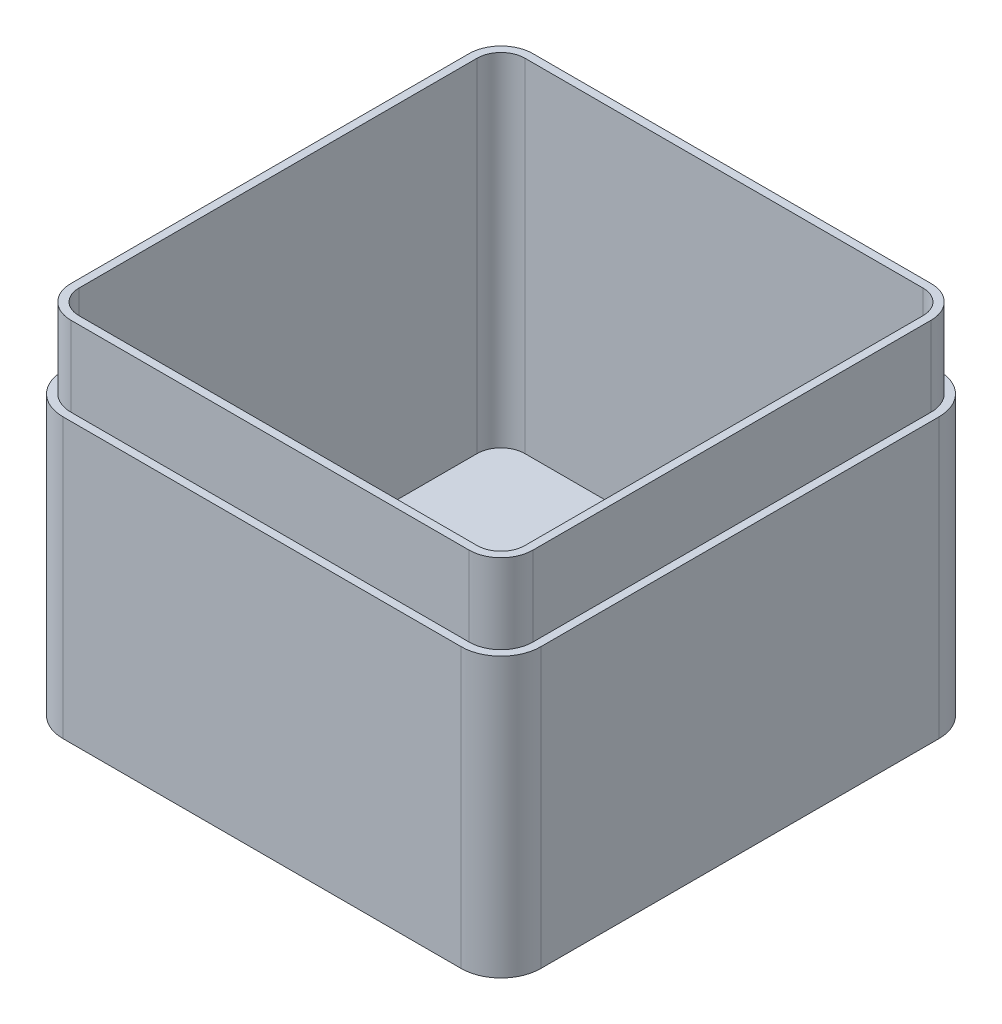
ISO-10303-21;
HEADER;
FILE_DESCRIPTION(('STEP AP214'),'2;1');
FILE_NAME('part.step','',(''),(''),'','','');
FILE_SCHEMA(('AUTOMOTIVE_DESIGN { 1 0 10303 214 1 1 1 1 }'));
ENDSEC;
DATA;
#1=APPLICATION_CONTEXT('core data for automotive mechanical design processes');
#2=APPLICATION_PROTOCOL_DEFINITION('international standard','automotive_design',2000,#1);
#3=PRODUCT_CONTEXT('',#1,'mechanical');
#4=PRODUCT('Part','Part','',(#3));
#5=PRODUCT_RELATED_PRODUCT_CATEGORY('part','',(#4));
#6=PRODUCT_DEFINITION_FORMATION('','',#4);
#7=PRODUCT_DEFINITION_CONTEXT('part definition',#1,'design');
#8=PRODUCT_DEFINITION('design','',#6,#7);
#9=PRODUCT_DEFINITION_SHAPE('','',#8);
#10=(LENGTH_UNIT() NAMED_UNIT(*) SI_UNIT(.MILLI.,.METRE.));
#11=(NAMED_UNIT(*) PLANE_ANGLE_UNIT() SI_UNIT($,.RADIAN.));
#12=(NAMED_UNIT(*) SI_UNIT($,.STERADIAN.) SOLID_ANGLE_UNIT());
#13=UNCERTAINTY_MEASURE_WITH_UNIT(LENGTH_MEASURE(1.E-05),#10,'distance_accuracy_value','');
#14=(GEOMETRIC_REPRESENTATION_CONTEXT(3) GLOBAL_UNCERTAINTY_ASSIGNED_CONTEXT((#13)) GLOBAL_UNIT_ASSIGNED_CONTEXT((#10,
#11,#12)) REPRESENTATION_CONTEXT('',''));
#15=CARTESIAN_POINT('',(0.,0.,0.));
#16=DIRECTION('',(0.,0.,1.));
#17=DIRECTION('',(1.,0.,0.));
#18=AXIS2_PLACEMENT_3D('',#15,#16,#17);
#19=CARTESIAN_POINT('',(0.,90.,0.));
#20=DIRECTION('',(0.,-1.,0.));
#21=DIRECTION('',(0.,0.,-1.));
#22=AXIS2_PLACEMENT_3D('',#19,#20,#21);
#23=PLANE('',#22);
#24=DIRECTION('',(0.,0.,-1.));
#25=VECTOR('',#24,1.);
#26=CARTESIAN_POINT('',(56.,90.,0.));
#27=LINE('',#26,#25);
#28=CARTESIAN_POINT('',(56.,90.,50.));
#29=VERTEX_POINT('',#28);
#30=CARTESIAN_POINT('',(56.,90.,-50.));
#31=VERTEX_POINT('',#30);
#32=EDGE_CURVE('E344',#29,#31,#27,.T.);
#33=ORIENTED_EDGE('',*,*,#32,.F.);
#34=CARTESIAN_POINT('',(50.,90.,50.));
#35=DIRECTION('',(0.,-1.,0.));
#36=DIRECTION('',(0.,0.,-1.));
#37=AXIS2_PLACEMENT_3D('',#34,#35,#36);
#38=CIRCLE('',#37,6.);
#39=CARTESIAN_POINT('',(50.,90.,56.));
#40=VERTEX_POINT('',#39);
#41=EDGE_CURVE('E390',#40,#29,#38,.F.);
#42=ORIENTED_EDGE('',*,*,#41,.F.);
#43=DIRECTION('',(1.,0.,0.));
#44=VECTOR('',#43,1.);
#45=CARTESIAN_POINT('',(0.,90.,56.));
#46=LINE('',#45,#44);
#47=CARTESIAN_POINT('',(-50.,90.,56.));
#48=VERTEX_POINT('',#47);
#49=EDGE_CURVE('E359',#48,#40,#46,.T.);
#50=ORIENTED_EDGE('',*,*,#49,.F.);
#51=CARTESIAN_POINT('',(-50.,90.,50.));
#52=DIRECTION('',(0.,-1.,0.));
#53=DIRECTION('',(0.,0.,-1.));
#54=AXIS2_PLACEMENT_3D('',#51,#52,#53);
#55=CIRCLE('',#54,6.);
#56=CARTESIAN_POINT('',(-56.,90.,50.));
#57=VERTEX_POINT('',#56);
#58=EDGE_CURVE('E323',#57,#48,#55,.F.);
#59=ORIENTED_EDGE('',*,*,#58,.F.);
#60=DIRECTION('',(0.,0.,1.));
#61=VECTOR('',#60,1.);
#62=CARTESIAN_POINT('',(-56.,90.,0.));
#63=LINE('',#62,#61);
#64=CARTESIAN_POINT('',(-56.,90.,-50.));
#65=VERTEX_POINT('',#64);
#66=EDGE_CURVE('E387',#65,#57,#63,.T.);
#67=ORIENTED_EDGE('',*,*,#66,.F.);
#68=CARTESIAN_POINT('',(-50.,90.,-50.));
#69=DIRECTION('',(0.,-1.,0.));
#70=DIRECTION('',(0.,0.,-1.));
#71=AXIS2_PLACEMENT_3D('',#68,#69,#70);
#72=CIRCLE('',#71,6.);
#73=CARTESIAN_POINT('',(-50.,90.,-56.));
#74=VERTEX_POINT('',#73);
#75=EDGE_CURVE('E383',#74,#65,#72,.F.);
#76=ORIENTED_EDGE('',*,*,#75,.F.);
#77=DIRECTION('',(-1.,0.,0.));
#78=VECTOR('',#77,1.);
#79=CARTESIAN_POINT('',(0.,90.,-56.));
#80=LINE('',#79,#78);
#81=CARTESIAN_POINT('',(50.,90.,-56.));
#82=VERTEX_POINT('',#81);
#83=EDGE_CURVE('E380',#82,#74,#80,.T.);
#84=ORIENTED_EDGE('',*,*,#83,.F.);
#85=CARTESIAN_POINT('',(50.,90.,-50.));
#86=DIRECTION('',(0.,-1.,0.));
#87=DIRECTION('',(0.,0.,-1.));
#88=AXIS2_PLACEMENT_3D('',#85,#86,#87);
#89=CIRCLE('',#88,6.);
#90=EDGE_CURVE('E368',#31,#82,#89,.F.);
#91=ORIENTED_EDGE('',*,*,#90,.F.);
#92=EDGE_LOOP('',(#33,#42,#50,#59,#67,#76,#84,#91));
#93=FACE_BOUND('',#92,.T.);
#94=CARTESIAN_POINT('',(50.,90.0000000000007,50.0000000000002));
#95=DIRECTION('',(0.,1.00000000000001,0.));
#96=DIRECTION('',(0.,0.,1.00000000000001));
#97=AXIS2_PLACEMENT_3D('',#94,#95,#96);
#98=CIRCLE('',#97,8.);
#99=CARTESIAN_POINT('',(50.,90.,58.));
#100=VERTEX_POINT('',#99);
#101=CARTESIAN_POINT('',(58.,90.0000000000007,50.0000000000002));
#102=VERTEX_POINT('',#101);
#103=EDGE_CURVE('E55',#100,#102,#98,.T.);
#104=ORIENTED_EDGE('',*,*,#103,.T.);
#105=DIRECTION('',(0.,0.,-1.00000000000001));
#106=VECTOR('',#105,1.);
#107=CARTESIAN_POINT('',(58.,90.0000000000007,0.));
#108=LINE('',#107,#106);
#109=CARTESIAN_POINT('',(58.,90.0000000000006,-50.0000000000005));
#110=VERTEX_POINT('',#109);
#111=EDGE_CURVE('E226',#102,#110,#108,.T.);
#112=ORIENTED_EDGE('',*,*,#111,.T.);
#113=CARTESIAN_POINT('',(50.,90.0000000000006,-50.0000000000005));
#114=DIRECTION('',(0.,1.00000000000001,0.));
#115=DIRECTION('',(0.,0.,1.00000000000001));
#116=AXIS2_PLACEMENT_3D('',#113,#114,#115);
#117=CIRCLE('',#116,8.00000000000001);
#118=CARTESIAN_POINT('',(50.,90.0000000000007,-58.0000000000006));
#119=VERTEX_POINT('',#118);
#120=EDGE_CURVE('E230',#110,#119,#117,.T.);
#121=ORIENTED_EDGE('',*,*,#120,.T.);
#122=DIRECTION('',(-1.,0.,0.));
#123=VECTOR('',#122,1.);
#124=CARTESIAN_POINT('',(0.,90.0000000000007,-58.0000000000006));
#125=LINE('',#124,#123);
#126=CARTESIAN_POINT('',(-50.,90.0000000000007,-58.0000000000006));
#127=VERTEX_POINT('',#126);
#128=EDGE_CURVE('E288',#119,#127,#125,.T.);
#129=ORIENTED_EDGE('',*,*,#128,.T.);
#130=CARTESIAN_POINT('',(-50.,90.0000000000006,-50.0000000000005));
#131=DIRECTION('',(0.,1.00000000000001,0.));
#132=DIRECTION('',(0.,0.,1.00000000000001));
#133=AXIS2_PLACEMENT_3D('',#130,#131,#132);
#134=CIRCLE('',#133,8.00000000000001);
#135=CARTESIAN_POINT('',(-58.,90.0000000000006,-50.0000000000005));
#136=VERTEX_POINT('',#135);
#137=EDGE_CURVE('E284',#127,#136,#134,.T.);
#138=ORIENTED_EDGE('',*,*,#137,.T.);
#139=DIRECTION('',(0.,0.,1.00000000000001));
#140=VECTOR('',#139,1.);
#141=CARTESIAN_POINT('',(-58.,90.0000000000007,0.));
#142=LINE('',#141,#140);
#143=CARTESIAN_POINT('',(-58.,90.0000000000007,50.0000000000002));
#144=VERTEX_POINT('',#143);
#145=EDGE_CURVE('E280',#136,#144,#142,.T.);
#146=ORIENTED_EDGE('',*,*,#145,.T.);
#147=CARTESIAN_POINT('',(-50.,90.0000000000007,50.0000000000002));
#148=DIRECTION('',(0.,1.00000000000001,0.));
#149=DIRECTION('',(0.,0.,1.00000000000001));
#150=AXIS2_PLACEMENT_3D('',#147,#148,#149);
#151=CIRCLE('',#150,8.);
#152=CARTESIAN_POINT('',(-50.,90.0000000000013,58.));
#153=VERTEX_POINT('',#152);
#154=EDGE_CURVE('E276',#144,#153,#151,.T.);
#155=ORIENTED_EDGE('',*,*,#154,.T.);
#156=DIRECTION('',(1.,0.,0.));
#157=VECTOR('',#156,1.);
#158=CARTESIAN_POINT('',(0.,90.0000000000013,58.));
#159=LINE('',#158,#157);
#160=EDGE_CURVE('E273',#153,#100,#159,.T.);
#161=ORIENTED_EDGE('',*,*,#160,.T.);
#162=EDGE_LOOP('',(#104,#112,#121,#129,#138,#146,#155,#161));
#163=FACE_BOUND('',#162,.T.);
#164=ADVANCED_FACE('F39',(#93,#163),#23,.F.);
#165=CARTESIAN_POINT('',(56.,90.,60.));
#166=DIRECTION('',(-1.,0.,0.));
#167=DIRECTION('',(0.,0.,1.));
#168=AXIS2_PLACEMENT_3D('',#165,#166,#167);
#169=PLANE('',#168);
#170=DIRECTION('',(0.,0.,-1.));
#171=VECTOR('',#170,1.);
#172=CARTESIAN_POINT('',(56.,4.,0.));
#173=LINE('',#172,#171);
#174=CARTESIAN_POINT('',(56.,4.,50.));
#175=VERTEX_POINT('',#174);
#176=CARTESIAN_POINT('',(56.,4.,-50.));
#177=VERTEX_POINT('',#176);
#178=EDGE_CURVE('E298',#175,#177,#173,.T.);
#179=ORIENTED_EDGE('',*,*,#178,.F.);
#180=DIRECTION('',(0.,1.,0.));
#181=VECTOR('',#180,1.);
#182=CARTESIAN_POINT('',(56.,90.,50.));
#183=LINE('',#182,#181);
#184=EDGE_CURVE('E324',#29,#175,#183,.F.);
#185=ORIENTED_EDGE('',*,*,#184,.F.);
#186=ORIENTED_EDGE('',*,*,#32,.T.);
#187=DIRECTION('',(0.,1.,0.));
#188=VECTOR('',#187,1.);
#189=CARTESIAN_POINT('',(56.,90.,-50.));
#190=LINE('',#189,#188);
#191=EDGE_CURVE('E320',#177,#31,#190,.T.);
#192=ORIENTED_EDGE('',*,*,#191,.F.);
#193=EDGE_LOOP('',(#179,#185,#186,#192));
#194=FACE_BOUND('',#193,.T.);
#195=ADVANCED_FACE('F498',(#194),#169,.T.);
#196=CARTESIAN_POINT('',(-60.,90.,-56.));
#197=DIRECTION('',(0.,0.,1.));
#198=DIRECTION('',(1.,0.,0.));
#199=AXIS2_PLACEMENT_3D('',#196,#197,#198);
#200=PLANE('',#199);
#201=ORIENTED_EDGE('',*,*,#83,.T.);
#202=DIRECTION('',(0.,1.,0.));
#203=VECTOR('',#202,1.);
#204=CARTESIAN_POINT('',(-50.,90.,-56.));
#205=LINE('',#204,#203);
#206=CARTESIAN_POINT('',(-50.,4.,-56.));
#207=VERTEX_POINT('',#206);
#208=EDGE_CURVE('E356',#207,#74,#205,.T.);
#209=ORIENTED_EDGE('',*,*,#208,.F.);
#210=DIRECTION('',(-1.,0.,0.));
#211=VECTOR('',#210,1.);
#212=CARTESIAN_POINT('',(0.,4.,-56.));
#213=LINE('',#212,#211);
#214=CARTESIAN_POINT('',(50.,4.,-56.));
#215=VERTEX_POINT('',#214);
#216=EDGE_CURVE('E319',#215,#207,#213,.T.);
#217=ORIENTED_EDGE('',*,*,#216,.F.);
#218=DIRECTION('',(0.,1.,0.));
#219=VECTOR('',#218,1.);
#220=CARTESIAN_POINT('',(50.,90.,-56.));
#221=LINE('',#220,#219);
#222=EDGE_CURVE('E347',#82,#215,#221,.F.);
#223=ORIENTED_EDGE('',*,*,#222,.F.);
#224=EDGE_LOOP('',(#201,#209,#217,#223));
#225=FACE_BOUND('',#224,.T.);
#226=ADVANCED_FACE('F504',(#225),#200,.T.);
#227=CARTESIAN_POINT('',(-56.,90.,60.));
#228=DIRECTION('',(1.,0.,0.));
#229=DIRECTION('',(0.,0.,-1.));
#230=AXIS2_PLACEMENT_3D('',#227,#228,#229);
#231=PLANE('',#230);
#232=ORIENTED_EDGE('',*,*,#66,.T.);
#233=DIRECTION('',(0.,1.,0.));
#234=VECTOR('',#233,1.);
#235=CARTESIAN_POINT('',(-56.,90.,50.));
#236=LINE('',#235,#234);
#237=CARTESIAN_POINT('',(-56.,4.,50.));
#238=VERTEX_POINT('',#237);
#239=EDGE_CURVE('E365',#238,#57,#236,.T.);
#240=ORIENTED_EDGE('',*,*,#239,.F.);
#241=DIRECTION('',(0.,0.,1.));
#242=VECTOR('',#241,1.);
#243=CARTESIAN_POINT('',(-56.,4.,0.));
#244=LINE('',#243,#242);
#245=CARTESIAN_POINT('',(-56.,4.,-50.));
#246=VERTEX_POINT('',#245);
#247=EDGE_CURVE('E332',#246,#238,#244,.T.);
#248=ORIENTED_EDGE('',*,*,#247,.F.);
#249=DIRECTION('',(0.,1.,0.));
#250=VECTOR('',#249,1.);
#251=CARTESIAN_POINT('',(-56.,90.,-50.));
#252=LINE('',#251,#250);
#253=EDGE_CURVE('E360',#65,#246,#252,.F.);
#254=ORIENTED_EDGE('',*,*,#253,.F.);
#255=EDGE_LOOP('',(#232,#240,#248,#254));
#256=FACE_BOUND('',#255,.T.);
#257=ADVANCED_FACE('F699',(#256),#231,.T.);
#258=CARTESIAN_POINT('',(-60.,90.,56.));
#259=DIRECTION('',(0.,0.,-1.));
#260=DIRECTION('',(-1.,0.,0.));
#261=AXIS2_PLACEMENT_3D('',#258,#259,#260);
#262=PLANE('',#261);
#263=DIRECTION('',(1.,0.,0.));
#264=VECTOR('',#263,1.);
#265=CARTESIAN_POINT('',(0.,4.,56.));
#266=LINE('',#265,#264);
#267=CARTESIAN_POINT('',(-50.,4.,56.));
#268=VERTEX_POINT('',#267);
#269=CARTESIAN_POINT('',(50.,4.,56.));
#270=VERTEX_POINT('',#269);
#271=EDGE_CURVE('E340',#268,#270,#266,.T.);
#272=ORIENTED_EDGE('',*,*,#271,.F.);
#273=DIRECTION('',(0.,1.,0.));
#274=VECTOR('',#273,1.);
#275=CARTESIAN_POINT('',(-50.,90.,56.));
#276=LINE('',#275,#274);
#277=EDGE_CURVE('E364',#48,#268,#276,.F.);
#278=ORIENTED_EDGE('',*,*,#277,.F.);
#279=ORIENTED_EDGE('',*,*,#49,.T.);
#280=DIRECTION('',(0.,1.,0.));
#281=VECTOR('',#280,1.);
#282=CARTESIAN_POINT('',(50.,90.,56.));
#283=LINE('',#282,#281);
#284=EDGE_CURVE('E372',#270,#40,#283,.T.);
#285=ORIENTED_EDGE('',*,*,#284,.F.);
#286=EDGE_LOOP('',(#272,#278,#279,#285));
#287=FACE_BOUND('',#286,.T.);
#288=ADVANCED_FACE('F689',(#287),#262,.T.);
#289=CARTESIAN_POINT('',(0.,4.,0.));
#290=DIRECTION('',(0.,-1.,0.));
#291=DIRECTION('',(0.,0.,-1.));
#292=AXIS2_PLACEMENT_3D('',#289,#290,#291);
#293=PLANE('',#292);
#294=ORIENTED_EDGE('',*,*,#216,.T.);
#295=CARTESIAN_POINT('',(-50.,4.,-50.));
#296=DIRECTION('',(0.,-1.,0.));
#297=DIRECTION('',(0.,0.,-1.));
#298=AXIS2_PLACEMENT_3D('',#295,#296,#297);
#299=CIRCLE('',#298,6.);
#300=EDGE_CURVE('E335',#246,#207,#299,.T.);
#301=ORIENTED_EDGE('',*,*,#300,.F.);
#302=ORIENTED_EDGE('',*,*,#247,.T.);
#303=CARTESIAN_POINT('',(-50.,4.,50.));
#304=DIRECTION('',(0.,-1.,0.));
#305=DIRECTION('',(0.,0.,-1.));
#306=AXIS2_PLACEMENT_3D('',#303,#304,#305);
#307=CIRCLE('',#306,6.);
#308=EDGE_CURVE('E339',#268,#238,#307,.T.);
#309=ORIENTED_EDGE('',*,*,#308,.F.);
#310=ORIENTED_EDGE('',*,*,#271,.T.);
#311=CARTESIAN_POINT('',(50.,4.,50.));
#312=DIRECTION('',(0.,-1.,0.));
#313=DIRECTION('',(0.,0.,-1.));
#314=AXIS2_PLACEMENT_3D('',#311,#312,#313);
#315=CIRCLE('',#314,6.);
#316=EDGE_CURVE('E336',#175,#270,#315,.T.);
#317=ORIENTED_EDGE('',*,*,#316,.F.);
#318=ORIENTED_EDGE('',*,*,#178,.T.);
#319=CARTESIAN_POINT('',(50.,4.,-50.));
#320=DIRECTION('',(0.,-1.,0.));
#321=DIRECTION('',(0.,0.,-1.));
#322=AXIS2_PLACEMENT_3D('',#319,#320,#321);
#323=CIRCLE('',#322,6.);
#324=EDGE_CURVE('E328',#215,#177,#323,.T.);
#325=ORIENTED_EDGE('',*,*,#324,.F.);
#326=EDGE_LOOP('',(#294,#301,#302,#309,#310,#317,#318,#325));
#327=FACE_BOUND('',#326,.T.);
#328=ADVANCED_FACE('F679',(#327),#293,.F.);
#329=CARTESIAN_POINT('',(50.,90.,-50.));
#330=DIRECTION('',(0.,-1.,0.));
#331=DIRECTION('',(0.,0.,-1.));
#332=AXIS2_PLACEMENT_3D('',#329,#330,#331);
#333=CYLINDRICAL_SURFACE('',#332,6.);
#334=ORIENTED_EDGE('',*,*,#90,.T.);
#335=ORIENTED_EDGE('',*,*,#222,.T.);
#336=ORIENTED_EDGE('',*,*,#324,.T.);
#337=ORIENTED_EDGE('',*,*,#191,.T.);
#338=EDGE_LOOP('',(#334,#335,#336,#337));
#339=FACE_BOUND('',#338,.T.);
#340=ADVANCED_FACE('F669',(#339),#333,.F.);
#341=CARTESIAN_POINT('',(-50.,90.,-50.));
#342=DIRECTION('',(0.,-1.,0.));
#343=DIRECTION('',(0.,0.,-1.));
#344=AXIS2_PLACEMENT_3D('',#341,#342,#343);
#345=CYLINDRICAL_SURFACE('',#344,6.);
#346=ORIENTED_EDGE('',*,*,#75,.T.);
#347=ORIENTED_EDGE('',*,*,#253,.T.);
#348=ORIENTED_EDGE('',*,*,#300,.T.);
#349=ORIENTED_EDGE('',*,*,#208,.T.);
#350=EDGE_LOOP('',(#346,#347,#348,#349));
#351=FACE_BOUND('',#350,.T.);
#352=ADVANCED_FACE('F660',(#351),#345,.F.);
#353=CARTESIAN_POINT('',(50.,90.,50.));
#354=DIRECTION('',(0.,-1.,0.));
#355=DIRECTION('',(0.,0.,-1.));
#356=AXIS2_PLACEMENT_3D('',#353,#354,#355);
#357=CYLINDRICAL_SURFACE('',#356,6.);
#358=ORIENTED_EDGE('',*,*,#41,.T.);
#359=ORIENTED_EDGE('',*,*,#184,.T.);
#360=ORIENTED_EDGE('',*,*,#316,.T.);
#361=ORIENTED_EDGE('',*,*,#284,.T.);
#362=EDGE_LOOP('',(#358,#359,#360,#361));
#363=FACE_BOUND('',#362,.T.);
#364=ADVANCED_FACE('F651',(#363),#357,.F.);
#365=CARTESIAN_POINT('',(-50.,90.,50.));
#366=DIRECTION('',(0.,-1.,0.));
#367=DIRECTION('',(0.,0.,-1.));
#368=AXIS2_PLACEMENT_3D('',#365,#366,#367);
#369=CYLINDRICAL_SURFACE('',#368,6.);
#370=ORIENTED_EDGE('',*,*,#58,.T.);
#371=ORIENTED_EDGE('',*,*,#277,.T.);
#372=ORIENTED_EDGE('',*,*,#308,.T.);
#373=ORIENTED_EDGE('',*,*,#239,.T.);
#374=EDGE_LOOP('',(#370,#371,#372,#373));
#375=FACE_BOUND('',#374,.T.);
#376=ADVANCED_FACE('F511',(#375),#369,.F.);
#377=CARTESIAN_POINT('',(50.,70.0000000000007,50.0000000000002));
#378=DIRECTION('',(0.,1.,0.));
#379=DIRECTION('',(0.,0.,1.));
#380=AXIS2_PLACEMENT_3D('',#377,#378,#379);
#381=CYLINDRICAL_SURFACE('',#380,8.);
#382=ORIENTED_EDGE('',*,*,#103,.F.);
#383=DIRECTION('',(0.,1.,0.));
#384=VECTOR('',#383,1.);
#385=CARTESIAN_POINT('',(50.,70.0000000000013,58.));
#386=LINE('',#385,#384);
#387=CARTESIAN_POINT('',(50.,70.0000000000013,58.));
#388=VERTEX_POINT('',#387);
#389=EDGE_CURVE('E206',#388,#100,#386,.T.);
#390=ORIENTED_EDGE('',*,*,#389,.F.);
#391=CARTESIAN_POINT('',(50.,70.0000000000007,50.0000000000002));
#392=DIRECTION('',(0.,1.00000000000001,0.));
#393=DIRECTION('',(0.,0.,1.00000000000001));
#394=AXIS2_PLACEMENT_3D('',#391,#392,#393);
#395=CIRCLE('',#394,8.);
#396=CARTESIAN_POINT('',(58.,70.0000000000007,50.0000000000002));
#397=VERTEX_POINT('',#396);
#398=EDGE_CURVE('E214',#388,#397,#395,.T.);
#399=ORIENTED_EDGE('',*,*,#398,.T.);
#400=DIRECTION('',(0.,1.,0.));
#401=VECTOR('',#400,1.);
#402=CARTESIAN_POINT('',(58.,70.0000000000007,50.0000000000002));
#403=LINE('',#402,#401);
#404=EDGE_CURVE('E295',#397,#102,#403,.T.);
#405=ORIENTED_EDGE('',*,*,#404,.T.);
#406=EDGE_LOOP('',(#382,#390,#399,#405));
#407=FACE_BOUND('',#406,.T.);
#408=ADVANCED_FACE('F217',(#407),#381,.T.);
#409=CARTESIAN_POINT('',(58.,70.0000000000007,0.));
#410=DIRECTION('',(1.,0.,0.));
#411=DIRECTION('',(0.,0.,-1.));
#412=AXIS2_PLACEMENT_3D('',#409,#410,#411);
#413=PLANE('',#412);
#414=ORIENTED_EDGE('',*,*,#111,.F.);
#415=ORIENTED_EDGE('',*,*,#404,.F.);
#416=DIRECTION('',(0.,0.,-1.00000000000001));
#417=VECTOR('',#416,1.);
#418=CARTESIAN_POINT('',(58.,70.0000000000007,0.));
#419=LINE('',#418,#417);
#420=CARTESIAN_POINT('',(58.,70.0000000000006,-50.0000000000005));
#421=VERTEX_POINT('',#420);
#422=EDGE_CURVE('E224',#397,#421,#419,.T.);
#423=ORIENTED_EDGE('',*,*,#422,.T.);
#424=DIRECTION('',(0.,1.,0.));
#425=VECTOR('',#424,1.);
#426=CARTESIAN_POINT('',(58.,70.0000000000006,-50.0000000000005));
#427=LINE('',#426,#425);
#428=EDGE_CURVE('E299',#421,#110,#427,.T.);
#429=ORIENTED_EDGE('',*,*,#428,.T.);
#430=EDGE_LOOP('',(#414,#415,#423,#429));
#431=FACE_BOUND('',#430,.T.);
#432=ADVANCED_FACE('F547',(#431),#413,.T.);
#433=CARTESIAN_POINT('',(50.,70.0000000000006,-50.0000000000005));
#434=DIRECTION('',(0.,1.,0.));
#435=DIRECTION('',(0.,0.,1.));
#436=AXIS2_PLACEMENT_3D('',#433,#434,#435);
#437=CYLINDRICAL_SURFACE('',#436,8.00000000000001);
#438=ORIENTED_EDGE('',*,*,#120,.F.);
#439=ORIENTED_EDGE('',*,*,#428,.F.);
#440=CARTESIAN_POINT('',(50.,70.0000000000006,-50.0000000000005));
#441=DIRECTION('',(0.,1.00000000000001,0.));
#442=DIRECTION('',(0.,0.,1.00000000000001));
#443=AXIS2_PLACEMENT_3D('',#440,#441,#442);
#444=CIRCLE('',#443,8.00000000000001);
#445=CARTESIAN_POINT('',(50.,70.0000000000007,-58.0000000000006));
#446=VERTEX_POINT('',#445);
#447=EDGE_CURVE('E244',#421,#446,#444,.T.);
#448=ORIENTED_EDGE('',*,*,#447,.T.);
#449=DIRECTION('',(0.,1.,0.));
#450=VECTOR('',#449,1.);
#451=CARTESIAN_POINT('',(50.,70.0000000000007,-58.0000000000006));
#452=LINE('',#451,#450);
#453=EDGE_CURVE('E302',#446,#119,#452,.T.);
#454=ORIENTED_EDGE('',*,*,#453,.T.);
#455=EDGE_LOOP('',(#438,#439,#448,#454));
#456=FACE_BOUND('',#455,.T.);
#457=ADVANCED_FACE('F555',(#456),#437,.T.);
#458=CARTESIAN_POINT('',(0.,70.0000000000007,-58.0000000000006));
#459=DIRECTION('',(0.,0.,-1.));
#460=DIRECTION('',(-1.,0.,0.));
#461=AXIS2_PLACEMENT_3D('',#458,#459,#460);
#462=PLANE('',#461);
#463=ORIENTED_EDGE('',*,*,#128,.F.);
#464=ORIENTED_EDGE('',*,*,#453,.F.);
#465=DIRECTION('',(-1.,0.,0.));
#466=VECTOR('',#465,1.);
#467=CARTESIAN_POINT('',(0.,70.0000000000007,-58.0000000000006));
#468=LINE('',#467,#466);
#469=CARTESIAN_POINT('',(-50.,70.0000000000007,-58.0000000000006));
#470=VERTEX_POINT('',#469);
#471=EDGE_CURVE('E241',#446,#470,#468,.T.);
#472=ORIENTED_EDGE('',*,*,#471,.T.);
#473=DIRECTION('',(0.,1.,0.));
#474=VECTOR('',#473,1.);
#475=CARTESIAN_POINT('',(-50.,70.0000000000007,-58.0000000000006));
#476=LINE('',#475,#474);
#477=EDGE_CURVE('E305',#470,#127,#476,.T.);
#478=ORIENTED_EDGE('',*,*,#477,.T.);
#479=EDGE_LOOP('',(#463,#464,#472,#478));
#480=FACE_BOUND('',#479,.T.);
#481=ADVANCED_FACE('F564',(#480),#462,.T.);
#482=CARTESIAN_POINT('',(-50.,70.0000000000006,-50.0000000000005));
#483=DIRECTION('',(0.,1.,0.));
#484=DIRECTION('',(0.,0.,1.));
#485=AXIS2_PLACEMENT_3D('',#482,#483,#484);
#486=CYLINDRICAL_SURFACE('',#485,8.00000000000001);
#487=ORIENTED_EDGE('',*,*,#137,.F.);
#488=ORIENTED_EDGE('',*,*,#477,.F.);
#489=CARTESIAN_POINT('',(-50.,70.0000000000006,-50.0000000000005));
#490=DIRECTION('',(0.,1.00000000000001,0.));
#491=DIRECTION('',(0.,0.,1.00000000000001));
#492=AXIS2_PLACEMENT_3D('',#489,#490,#491);
#493=CIRCLE('',#492,8.00000000000001);
#494=CARTESIAN_POINT('',(-58.,70.0000000000006,-50.0000000000005));
#495=VERTEX_POINT('',#494);
#496=EDGE_CURVE('E238',#470,#495,#493,.T.);
#497=ORIENTED_EDGE('',*,*,#496,.T.);
#498=DIRECTION('',(0.,1.,0.));
#499=VECTOR('',#498,1.);
#500=CARTESIAN_POINT('',(-58.,70.0000000000006,-50.0000000000005));
#501=LINE('',#500,#499);
#502=EDGE_CURVE('E308',#495,#136,#501,.T.);
#503=ORIENTED_EDGE('',*,*,#502,.T.);
#504=EDGE_LOOP('',(#487,#488,#497,#503));
#505=FACE_BOUND('',#504,.T.);
#506=ADVANCED_FACE('F573',(#505),#486,.T.);
#507=CARTESIAN_POINT('',(-58.,70.0000000000007,0.));
#508=DIRECTION('',(-1.,0.,0.));
#509=DIRECTION('',(0.,0.,1.));
#510=AXIS2_PLACEMENT_3D('',#507,#508,#509);
#511=PLANE('',#510);
#512=ORIENTED_EDGE('',*,*,#145,.F.);
#513=ORIENTED_EDGE('',*,*,#502,.F.);
#514=DIRECTION('',(0.,0.,1.00000000000001));
#515=VECTOR('',#514,1.);
#516=CARTESIAN_POINT('',(-58.,70.0000000000007,0.));
#517=LINE('',#516,#515);
#518=CARTESIAN_POINT('',(-58.,70.0000000000007,50.0000000000002));
#519=VERTEX_POINT('',#518);
#520=EDGE_CURVE('E235',#495,#519,#517,.T.);
#521=ORIENTED_EDGE('',*,*,#520,.T.);
#522=DIRECTION('',(0.,1.,0.));
#523=VECTOR('',#522,1.);
#524=CARTESIAN_POINT('',(-58.,70.0000000000007,50.0000000000002));
#525=LINE('',#524,#523);
#526=EDGE_CURVE('E311',#519,#144,#525,.T.);
#527=ORIENTED_EDGE('',*,*,#526,.T.);
#528=EDGE_LOOP('',(#512,#513,#521,#527));
#529=FACE_BOUND('',#528,.T.);
#530=ADVANCED_FACE('F582',(#529),#511,.T.);
#531=CARTESIAN_POINT('',(-50.,70.0000000000007,50.0000000000002));
#532=DIRECTION('',(0.,1.,0.));
#533=DIRECTION('',(0.,0.,1.));
#534=AXIS2_PLACEMENT_3D('',#531,#532,#533);
#535=CYLINDRICAL_SURFACE('',#534,8.);
#536=ORIENTED_EDGE('',*,*,#154,.F.);
#537=ORIENTED_EDGE('',*,*,#526,.F.);
#538=CARTESIAN_POINT('',(-50.,70.0000000000007,50.0000000000002));
#539=DIRECTION('',(0.,1.00000000000001,0.));
#540=DIRECTION('',(0.,0.,1.00000000000001));
#541=AXIS2_PLACEMENT_3D('',#538,#539,#540);
#542=CIRCLE('',#541,8.);
#543=CARTESIAN_POINT('',(-50.,70.0000000000013,58.));
#544=VERTEX_POINT('',#543);
#545=EDGE_CURVE('E213',#519,#544,#542,.T.);
#546=ORIENTED_EDGE('',*,*,#545,.T.);
#547=DIRECTION('',(0.,1.,0.));
#548=VECTOR('',#547,1.);
#549=CARTESIAN_POINT('',(-50.,70.0000000000013,58.));
#550=LINE('',#549,#548);
#551=EDGE_CURVE('E208',#544,#153,#550,.T.);
#552=ORIENTED_EDGE('',*,*,#551,.T.);
#553=EDGE_LOOP('',(#536,#537,#546,#552));
#554=FACE_BOUND('',#553,.T.);
#555=ADVANCED_FACE('F591',(#554),#535,.T.);
#556=CARTESIAN_POINT('',(0.,70.0000000000013,58.));
#557=DIRECTION('',(0.,0.,1.));
#558=DIRECTION('',(1.,0.,0.));
#559=AXIS2_PLACEMENT_3D('',#556,#557,#558);
#560=PLANE('',#559);
#561=ORIENTED_EDGE('',*,*,#160,.F.);
#562=ORIENTED_EDGE('',*,*,#551,.F.);
#563=DIRECTION('',(1.,0.,0.));
#564=VECTOR('',#563,1.);
#565=CARTESIAN_POINT('',(0.,70.0000000000013,58.));
#566=LINE('',#565,#564);
#567=EDGE_CURVE('E203',#544,#388,#566,.T.);
#568=ORIENTED_EDGE('',*,*,#567,.T.);
#569=ORIENTED_EDGE('',*,*,#389,.T.);
#570=EDGE_LOOP('',(#561,#562,#568,#569));
#571=FACE_BOUND('',#570,.T.);
#572=ADVANCED_FACE('F205',(#571),#560,.T.);
#573=CARTESIAN_POINT('',(0.,70.0000000000007,0.));
#574=DIRECTION('',(0.,1.00000000000001,0.));
#575=DIRECTION('',(0.,0.,1.00000000000001));
#576=AXIS2_PLACEMENT_3D('',#573,#574,#575);
#577=PLANE('',#576);
#578=ORIENTED_EDGE('',*,*,#398,.F.);
#579=ORIENTED_EDGE('',*,*,#567,.F.);
#580=ORIENTED_EDGE('',*,*,#545,.F.);
#581=ORIENTED_EDGE('',*,*,#520,.F.);
#582=ORIENTED_EDGE('',*,*,#496,.F.);
#583=ORIENTED_EDGE('',*,*,#471,.F.);
#584=ORIENTED_EDGE('',*,*,#447,.F.);
#585=ORIENTED_EDGE('',*,*,#422,.F.);
#586=EDGE_LOOP('',(#578,#579,#580,#581,#582,#583,#584,#585));
#587=FACE_BOUND('',#586,.T.);
#588=CARTESIAN_POINT('',(50.,70.0000000000007,50.0000000000002));
#589=DIRECTION('',(0.,1.00000000000001,0.));
#590=DIRECTION('',(0.,0.,1.00000000000001));
#591=AXIS2_PLACEMENT_3D('',#588,#589,#590);
#592=CIRCLE('',#591,10.);
#593=CARTESIAN_POINT('',(50.,70.0000000000007,60.0000000000001));
#594=VERTEX_POINT('',#593);
#595=CARTESIAN_POINT('',(60.,70.0000000000007,50.0000000000002));
#596=VERTEX_POINT('',#595);
#597=EDGE_CURVE('E249',#594,#596,#592,.T.);
#598=ORIENTED_EDGE('',*,*,#597,.T.);
#599=DIRECTION('',(0.,0.,-1.00000000000001));
#600=VECTOR('',#599,1.);
#601=CARTESIAN_POINT('',(60.,70.0000000000007,0.));
#602=LINE('',#601,#600);
#603=CARTESIAN_POINT('',(60.,70.0000000000006,-50.0000000000005));
#604=VERTEX_POINT('',#603);
#605=EDGE_CURVE('E252',#596,#604,#602,.T.);
#606=ORIENTED_EDGE('',*,*,#605,.T.);
#607=CARTESIAN_POINT('',(50.,70.0000000000006,-50.0000000000005));
#608=DIRECTION('',(0.,1.00000000000001,0.));
#609=DIRECTION('',(0.,0.,1.00000000000001));
#610=AXIS2_PLACEMENT_3D('',#607,#608,#609);
#611=CIRCLE('',#610,10.);
#612=CARTESIAN_POINT('',(50.,70.0000000000007,-60.0000000000006));
#613=VERTEX_POINT('',#612);
#614=EDGE_CURVE('E255',#604,#613,#611,.T.);
#615=ORIENTED_EDGE('',*,*,#614,.T.);
#616=DIRECTION('',(-1.,0.,0.));
#617=VECTOR('',#616,1.);
#618=CARTESIAN_POINT('',(0.,70.0000000000007,-60.0000000000006));
#619=LINE('',#618,#617);
#620=CARTESIAN_POINT('',(-50.,70.0000000000007,-60.0000000000006));
#621=VERTEX_POINT('',#620);
#622=EDGE_CURVE('E258',#613,#621,#619,.T.);
#623=ORIENTED_EDGE('',*,*,#622,.T.);
#624=CARTESIAN_POINT('',(-50.,70.0000000000006,-50.0000000000005));
#625=DIRECTION('',(0.,1.00000000000001,0.));
#626=DIRECTION('',(0.,0.,1.00000000000001));
#627=AXIS2_PLACEMENT_3D('',#624,#625,#626);
#628=CIRCLE('',#627,10.);
#629=CARTESIAN_POINT('',(-60.,70.0000000000006,-50.0000000000005));
#630=VERTEX_POINT('',#629);
#631=EDGE_CURVE('E261',#621,#630,#628,.T.);
#632=ORIENTED_EDGE('',*,*,#631,.T.);
#633=DIRECTION('',(0.,0.,1.00000000000001));
#634=VECTOR('',#633,1.);
#635=CARTESIAN_POINT('',(-60.,70.0000000000007,0.));
#636=LINE('',#635,#634);
#637=CARTESIAN_POINT('',(-60.,70.0000000000007,50.));
#638=VERTEX_POINT('',#637);
#639=EDGE_CURVE('E63',#630,#638,#636,.T.);
#640=ORIENTED_EDGE('',*,*,#639,.T.);
#641=CARTESIAN_POINT('',(-50.,70.0000000000007,50.0000000000002));
#642=DIRECTION('',(0.,1.00000000000001,0.));
#643=DIRECTION('',(0.,0.,1.00000000000001));
#644=AXIS2_PLACEMENT_3D('',#641,#642,#643);
#645=CIRCLE('',#644,10.);
#646=CARTESIAN_POINT('',(-50.,70.0000000000007,60.0000000000001));
#647=VERTEX_POINT('',#646);
#648=EDGE_CURVE('E266',#638,#647,#645,.T.);
#649=ORIENTED_EDGE('',*,*,#648,.T.);
#650=DIRECTION('',(1.,0.,0.));
#651=VECTOR('',#650,1.);
#652=CARTESIAN_POINT('',(0.,70.0000000000007,60.0000000000001));
#653=LINE('',#652,#651);
#654=EDGE_CURVE('E220',#647,#594,#653,.T.);
#655=ORIENTED_EDGE('',*,*,#654,.T.);
#656=EDGE_LOOP('',(#598,#606,#615,#623,#632,#640,#649,#655));
#657=FACE_BOUND('',#656,.T.);
#658=ADVANCED_FACE('F222',(#587,#657),#577,.T.);
#659=CARTESIAN_POINT('',(0.,0.,0.));
#660=DIRECTION('',(0.,-1.,0.));
#661=DIRECTION('',(0.,0.,-1.));
#662=AXIS2_PLACEMENT_3D('',#659,#660,#661);
#663=PLANE('',#662);
#664=DIRECTION('',(-1.,0.,0.));
#665=VECTOR('',#664,1.);
#666=CARTESIAN_POINT('',(-60.,0.,-60.));
#667=LINE('',#666,#665);
#668=CARTESIAN_POINT('',(50.,0.,-60.));
#669=VERTEX_POINT('',#668);
#670=CARTESIAN_POINT('',(-50.,0.,-60.));
#671=VERTEX_POINT('',#670);
#672=EDGE_CURVE('E403',#669,#671,#667,.T.);
#673=ORIENTED_EDGE('',*,*,#672,.F.);
#674=CARTESIAN_POINT('',(50.,0.,-50.));
#675=DIRECTION('',(0.,-1.,0.));
#676=DIRECTION('',(0.,0.,-1.));
#677=AXIS2_PLACEMENT_3D('',#674,#675,#676);
#678=CIRCLE('',#677,10.);
#679=CARTESIAN_POINT('',(60.,0.,-50.));
#680=VERTEX_POINT('',#679);
#681=EDGE_CURVE('E431',#669,#680,#678,.T.);
#682=ORIENTED_EDGE('',*,*,#681,.T.);
#683=DIRECTION('',(0.,0.,-1.));
#684=VECTOR('',#683,1.);
#685=CARTESIAN_POINT('',(60.,0.,60.));
#686=LINE('',#685,#684);
#687=CARTESIAN_POINT('',(60.,0.,50.));
#688=VERTEX_POINT('',#687);
#689=EDGE_CURVE('E376',#688,#680,#686,.T.);
#690=ORIENTED_EDGE('',*,*,#689,.F.);
#691=CARTESIAN_POINT('',(50.,0.,50.));
#692=DIRECTION('',(0.,-1.,0.));
#693=DIRECTION('',(0.,0.,-1.));
#694=AXIS2_PLACEMENT_3D('',#691,#692,#693);
#695=CIRCLE('',#694,10.);
#696=CARTESIAN_POINT('',(50.,0.,60.));
#697=VERTEX_POINT('',#696);
#698=EDGE_CURVE('E425',#688,#697,#695,.T.);
#699=ORIENTED_EDGE('',*,*,#698,.T.);
#700=DIRECTION('',(1.,0.,0.));
#701=VECTOR('',#700,1.);
#702=CARTESIAN_POINT('',(-60.,0.,60.));
#703=LINE('',#702,#701);
#704=CARTESIAN_POINT('',(-50.,0.,60.));
#705=VERTEX_POINT('',#704);
#706=EDGE_CURVE('E411',#705,#697,#703,.T.);
#707=ORIENTED_EDGE('',*,*,#706,.F.);
#708=CARTESIAN_POINT('',(-50.,0.,50.));
#709=DIRECTION('',(0.,-1.,0.));
#710=DIRECTION('',(0.,0.,-1.));
#711=AXIS2_PLACEMENT_3D('',#708,#709,#710);
#712=CIRCLE('',#711,10.);
#713=CARTESIAN_POINT('',(-60.,0.,50.));
#714=VERTEX_POINT('',#713);
#715=EDGE_CURVE('E422',#705,#714,#712,.T.);
#716=ORIENTED_EDGE('',*,*,#715,.T.);
#717=DIRECTION('',(0.,0.,1.));
#718=VECTOR('',#717,1.);
#719=CARTESIAN_POINT('',(-60.,0.,60.));
#720=LINE('',#719,#718);
#721=CARTESIAN_POINT('',(-60.,0.,-50.));
#722=VERTEX_POINT('',#721);
#723=EDGE_CURVE('E407',#722,#714,#720,.T.);
#724=ORIENTED_EDGE('',*,*,#723,.F.);
#725=CARTESIAN_POINT('',(-50.,0.,-50.));
#726=DIRECTION('',(0.,-1.,0.));
#727=DIRECTION('',(0.,0.,-1.));
#728=AXIS2_PLACEMENT_3D('',#725,#726,#727);
#729=CIRCLE('',#728,10.);
#730=EDGE_CURVE('E428',#722,#671,#729,.T.);
#731=ORIENTED_EDGE('',*,*,#730,.T.);
#732=EDGE_LOOP('',(#673,#682,#690,#699,#707,#716,#724,#731));
#733=FACE_BOUND('',#732,.T.);
#734=ADVANCED_FACE('F460',(#733),#663,.T.);
#735=CARTESIAN_POINT('',(50.,90.,50.));
#736=DIRECTION('',(0.,-1.,0.));
#737=DIRECTION('',(0.,0.,-1.));
#738=AXIS2_PLACEMENT_3D('',#735,#736,#737);
#739=CYLINDRICAL_SURFACE('',#738,10.);
#740=DIRECTION('',(0.,-1.,0.));
#741=VECTOR('',#740,1.);
#742=CARTESIAN_POINT('',(60.,90.,50.));
#743=LINE('',#742,#741);
#744=EDGE_CURVE('E434',#596,#688,#743,.T.);
#745=ORIENTED_EDGE('',*,*,#744,.F.);
#746=ORIENTED_EDGE('',*,*,#597,.F.);
#747=DIRECTION('',(0.,-1.,0.));
#748=VECTOR('',#747,1.);
#749=CARTESIAN_POINT('',(50.,90.,60.));
#750=LINE('',#749,#748);
#751=EDGE_CURVE('E11',#697,#594,#750,.F.);
#752=ORIENTED_EDGE('',*,*,#751,.F.);
#753=ORIENTED_EDGE('',*,*,#698,.F.);
#754=EDGE_LOOP('',(#745,#746,#752,#753));
#755=FACE_BOUND('',#754,.T.);
#756=ADVANCED_FACE('F465',(#755),#739,.T.);
#757=CARTESIAN_POINT('',(-50.,90.,50.));
#758=DIRECTION('',(0.,-1.,0.));
#759=DIRECTION('',(0.,0.,-1.));
#760=AXIS2_PLACEMENT_3D('',#757,#758,#759);
#761=CYLINDRICAL_SURFACE('',#760,10.);
#762=DIRECTION('',(0.,-1.,0.));
#763=VECTOR('',#762,1.);
#764=CARTESIAN_POINT('',(-50.,90.,60.));
#765=LINE('',#764,#763);
#766=EDGE_CURVE('E48',#647,#705,#765,.T.);
#767=ORIENTED_EDGE('',*,*,#766,.F.);
#768=ORIENTED_EDGE('',*,*,#648,.F.);
#769=DIRECTION('',(0.,-1.,0.));
#770=VECTOR('',#769,1.);
#771=CARTESIAN_POINT('',(-60.,90.,50.));
#772=LINE('',#771,#770);
#773=EDGE_CURVE('E441',#714,#638,#772,.F.);
#774=ORIENTED_EDGE('',*,*,#773,.F.);
#775=ORIENTED_EDGE('',*,*,#715,.F.);
#776=EDGE_LOOP('',(#767,#768,#774,#775));
#777=FACE_BOUND('',#776,.T.);
#778=ADVANCED_FACE('F41',(#777),#761,.T.);
#779=CARTESIAN_POINT('',(-60.,90.,60.));
#780=DIRECTION('',(0.,0.,-1.));
#781=DIRECTION('',(-1.,0.,0.));
#782=AXIS2_PLACEMENT_3D('',#779,#780,#781);
#783=PLANE('',#782);
#784=ORIENTED_EDGE('',*,*,#654,.F.);
#785=ORIENTED_EDGE('',*,*,#766,.T.);
#786=ORIENTED_EDGE('',*,*,#706,.T.);
#787=ORIENTED_EDGE('',*,*,#751,.T.);
#788=EDGE_LOOP('',(#784,#785,#786,#787));
#789=FACE_BOUND('',#788,.T.);
#790=ADVANCED_FACE('F452',(#789),#783,.F.);
#791=CARTESIAN_POINT('',(-50.,90.,-50.));
#792=DIRECTION('',(0.,-1.,0.));
#793=DIRECTION('',(0.,0.,-1.));
#794=AXIS2_PLACEMENT_3D('',#791,#792,#793);
#795=CYLINDRICAL_SURFACE('',#794,10.);
#796=DIRECTION('',(0.,-1.,0.));
#797=VECTOR('',#796,1.);
#798=CARTESIAN_POINT('',(-60.,90.,-50.));
#799=LINE('',#798,#797);
#800=EDGE_CURVE('E445',#630,#722,#799,.T.);
#801=ORIENTED_EDGE('',*,*,#800,.F.);
#802=ORIENTED_EDGE('',*,*,#631,.F.);
#803=DIRECTION('',(0.,-1.,0.));
#804=VECTOR('',#803,1.);
#805=CARTESIAN_POINT('',(-50.,90.,-60.));
#806=LINE('',#805,#804);
#807=EDGE_CURVE('E415',#671,#621,#806,.F.);
#808=ORIENTED_EDGE('',*,*,#807,.F.);
#809=ORIENTED_EDGE('',*,*,#730,.F.);
#810=EDGE_LOOP('',(#801,#802,#808,#809));
#811=FACE_BOUND('',#810,.T.);
#812=ADVANCED_FACE('F484',(#811),#795,.T.);
#813=CARTESIAN_POINT('',(-60.,90.,60.));
#814=DIRECTION('',(1.,0.,0.));
#815=DIRECTION('',(0.,0.,-1.));
#816=AXIS2_PLACEMENT_3D('',#813,#814,#815);
#817=PLANE('',#816);
#818=ORIENTED_EDGE('',*,*,#639,.F.);
#819=ORIENTED_EDGE('',*,*,#800,.T.);
#820=ORIENTED_EDGE('',*,*,#723,.T.);
#821=ORIENTED_EDGE('',*,*,#773,.T.);
#822=EDGE_LOOP('',(#818,#819,#820,#821));
#823=FACE_BOUND('',#822,.T.);
#824=ADVANCED_FACE('F486',(#823),#817,.F.);
#825=CARTESIAN_POINT('',(50.,90.,-50.));
#826=DIRECTION('',(0.,-1.,0.));
#827=DIRECTION('',(0.,0.,-1.));
#828=AXIS2_PLACEMENT_3D('',#825,#826,#827);
#829=CYLINDRICAL_SURFACE('',#828,10.);
#830=DIRECTION('',(0.,-1.,0.));
#831=VECTOR('',#830,1.);
#832=CARTESIAN_POINT('',(50.,90.,-60.));
#833=LINE('',#832,#831);
#834=EDGE_CURVE('E419',#613,#669,#833,.T.);
#835=ORIENTED_EDGE('',*,*,#834,.F.);
#836=ORIENTED_EDGE('',*,*,#614,.F.);
#837=DIRECTION('',(0.,-1.,0.));
#838=VECTOR('',#837,1.);
#839=CARTESIAN_POINT('',(60.,90.,-50.));
#840=LINE('',#839,#838);
#841=EDGE_CURVE('E437',#680,#604,#840,.F.);
#842=ORIENTED_EDGE('',*,*,#841,.F.);
#843=ORIENTED_EDGE('',*,*,#681,.F.);
#844=EDGE_LOOP('',(#835,#836,#842,#843));
#845=FACE_BOUND('',#844,.T.);
#846=ADVANCED_FACE('F475',(#845),#829,.T.);
#847=CARTESIAN_POINT('',(-60.,90.,-60.));
#848=DIRECTION('',(0.,0.,1.));
#849=DIRECTION('',(1.,0.,0.));
#850=AXIS2_PLACEMENT_3D('',#847,#848,#849);
#851=PLANE('',#850);
#852=ORIENTED_EDGE('',*,*,#622,.F.);
#853=ORIENTED_EDGE('',*,*,#834,.T.);
#854=ORIENTED_EDGE('',*,*,#672,.T.);
#855=ORIENTED_EDGE('',*,*,#807,.T.);
#856=EDGE_LOOP('',(#852,#853,#854,#855));
#857=FACE_BOUND('',#856,.T.);
#858=ADVANCED_FACE('F479',(#857),#851,.F.);
#859=CARTESIAN_POINT('',(60.,90.,60.));
#860=DIRECTION('',(-1.,0.,0.));
#861=DIRECTION('',(0.,0.,1.));
#862=AXIS2_PLACEMENT_3D('',#859,#860,#861);
#863=PLANE('',#862);
#864=ORIENTED_EDGE('',*,*,#605,.F.);
#865=ORIENTED_EDGE('',*,*,#744,.T.);
#866=ORIENTED_EDGE('',*,*,#689,.T.);
#867=ORIENTED_EDGE('',*,*,#841,.T.);
#868=EDGE_LOOP('',(#864,#865,#866,#867));
#869=FACE_BOUND('',#868,.T.);
#870=ADVANCED_FACE('F470',(#869),#863,.F.);
#871=CLOSED_SHELL('',(#164,#195,#226,#257,#288,#328,#340,#352,#364,#376,#408,#432,#457,#481,
#506,#530,#555,#572,#658,#734,#756,#778,#790,#812,#824,#846,#858,#870));
#872=MANIFOLD_SOLID_BREP('B2',#871);
#873=ADVANCED_BREP_SHAPE_REPRESENTATION('',(#18,#872),#14);
#874=SHAPE_DEFINITION_REPRESENTATION(#9,#873);
ENDSEC;
END-ISO-10303-21;
